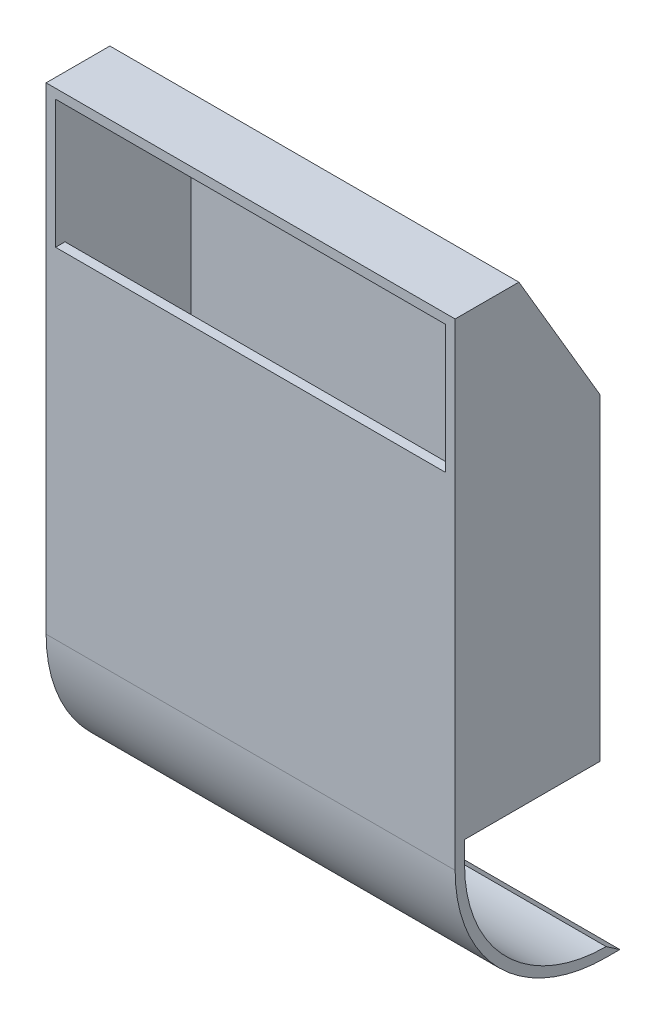
ISO-10303-21;
HEADER;
FILE_DESCRIPTION(('STEP AP214'),'2;1');
FILE_NAME('part.step','',(''),(''),'','','');
FILE_SCHEMA(('AUTOMOTIVE_DESIGN { 1 0 10303 214 1 1 1 1 }'));
ENDSEC;
DATA;
#1=APPLICATION_CONTEXT('core data for automotive mechanical design processes');
#2=APPLICATION_PROTOCOL_DEFINITION('international standard','automotive_design',2000,#1);
#3=PRODUCT_CONTEXT('',#1,'mechanical');
#4=PRODUCT('Part','Part','',(#3));
#5=PRODUCT_RELATED_PRODUCT_CATEGORY('part','',(#4));
#6=PRODUCT_DEFINITION_FORMATION('','',#4);
#7=PRODUCT_DEFINITION_CONTEXT('part definition',#1,'design');
#8=PRODUCT_DEFINITION('design','',#6,#7);
#9=PRODUCT_DEFINITION_SHAPE('','',#8);
#10=(LENGTH_UNIT() NAMED_UNIT(*) SI_UNIT(.MILLI.,.METRE.));
#11=(NAMED_UNIT(*) PLANE_ANGLE_UNIT() SI_UNIT($,.RADIAN.));
#12=(NAMED_UNIT(*) SI_UNIT($,.STERADIAN.) SOLID_ANGLE_UNIT());
#13=UNCERTAINTY_MEASURE_WITH_UNIT(LENGTH_MEASURE(1.E-05),#10,'distance_accuracy_value','');
#14=(GEOMETRIC_REPRESENTATION_CONTEXT(3) GLOBAL_UNCERTAINTY_ASSIGNED_CONTEXT((#13)) GLOBAL_UNIT_ASSIGNED_CONTEXT((#10,
#11,#12)) REPRESENTATION_CONTEXT('',''));
#15=CARTESIAN_POINT('',(0.,0.,0.));
#16=DIRECTION('',(0.,0.,1.));
#17=DIRECTION('',(1.,0.,0.));
#18=AXIS2_PLACEMENT_3D('',#15,#16,#17);
#19=CARTESIAN_POINT('',(0.,108.,-43.0406580426315));
#20=DIRECTION('',(0.,-0.499999999999998,0.86602540378444));
#21=DIRECTION('',(0.,-0.86602540378444,-0.499999999999998));
#22=AXIS2_PLACEMENT_3D('',#19,#20,#21);
#23=PLANE('',#22);
#24=DIRECTION('',(1.,0.,0.));
#25=VECTOR('',#24,1.);
#26=CARTESIAN_POINT('',(0.,148.765449908796,-19.5047145641519));
#27=LINE('',#26,#25);
#28=CARTESIAN_POINT('',(3.,148.765449908796,-19.5047145641519));
#29=VERTEX_POINT('',#28);
#30=CARTESIAN_POINT('',(127.,148.765449908796,-19.5047145641519));
#31=VERTEX_POINT('',#30);
#32=EDGE_CURVE('E182',#29,#31,#27,.T.);
#33=ORIENTED_EDGE('',*,*,#32,.F.);
#34=DIRECTION('',(0.,-0.86602540378444,-0.499999999999998));
#35=VECTOR('',#34,1.);
#36=CARTESIAN_POINT('',(3.,148.765449908796,-19.5047145641519));
#37=LINE('',#36,#35);
#38=CARTESIAN_POINT('',(3.,108.,-43.0406580426315));
#39=VERTEX_POINT('',#38);
#40=EDGE_CURVE('E167',#29,#39,#37,.T.);
#41=ORIENTED_EDGE('',*,*,#40,.T.);
#42=DIRECTION('',(1.,0.,0.));
#43=VECTOR('',#42,1.);
#44=CARTESIAN_POINT('',(0.,108.,-43.0406580426315));
#45=LINE('',#44,#43);
#46=CARTESIAN_POINT('',(127.,108.,-43.0406580426315));
#47=VERTEX_POINT('',#46);
#48=EDGE_CURVE('E178',#39,#47,#45,.T.);
#49=ORIENTED_EDGE('',*,*,#48,.T.);
#50=DIRECTION('',(0.,0.86602540378444,0.499999999999998));
#51=VECTOR('',#50,1.);
#52=CARTESIAN_POINT('',(127.,148.765449908796,-19.5047145641519));
#53=LINE('',#52,#51);
#54=EDGE_CURVE('E334',#47,#31,#53,.T.);
#55=ORIENTED_EDGE('',*,*,#54,.T.);
#56=EDGE_LOOP('',(#33,#41,#49,#55));
#57=FACE_BOUND('',#56,.T.);
#58=ADVANCED_FACE('F39',(#57),#23,.T.);
#59=CARTESIAN_POINT('',(0.,148.765449908796,-19.5047145641519));
#60=DIRECTION('',(0.,-1.,0.));
#61=DIRECTION('',(0.,0.,-1.));
#62=AXIS2_PLACEMENT_3D('',#59,#60,#61);
#63=PLANE('',#62);
#64=DIRECTION('',(1.,0.,0.));
#65=VECTOR('',#64,1.);
#66=CARTESIAN_POINT('',(0.,148.765449908796,0.));
#67=LINE('',#66,#65);
#68=CARTESIAN_POINT('',(3.,148.765449908796,0.));
#69=VERTEX_POINT('',#68);
#70=CARTESIAN_POINT('',(127.,148.765449908796,0.));
#71=VERTEX_POINT('',#70);
#72=EDGE_CURVE('E62',#69,#71,#67,.T.);
#73=ORIENTED_EDGE('',*,*,#72,.F.);
#74=DIRECTION('',(0.,0.,-1.));
#75=VECTOR('',#74,1.);
#76=CARTESIAN_POINT('',(3.,148.765449908796,0.));
#77=LINE('',#76,#75);
#78=EDGE_CURVE('E333',#69,#29,#77,.T.);
#79=ORIENTED_EDGE('',*,*,#78,.T.);
#80=ORIENTED_EDGE('',*,*,#32,.T.);
#81=DIRECTION('',(0.,0.,1.));
#82=VECTOR('',#81,1.);
#83=CARTESIAN_POINT('',(127.,148.765449908796,0.));
#84=LINE('',#83,#82);
#85=EDGE_CURVE('E329',#31,#71,#84,.T.);
#86=ORIENTED_EDGE('',*,*,#85,.T.);
#87=EDGE_LOOP('',(#73,#79,#80,#86));
#88=FACE_BOUND('',#87,.T.);
#89=ADVANCED_FACE('F341',(#88),#63,.T.);
#90=CARTESIAN_POINT('',(130.,108.,-3.));
#91=DIRECTION('',(0.,-1.,0.));
#92=DIRECTION('',(0.,0.,-1.));
#93=AXIS2_PLACEMENT_3D('',#90,#91,#92);
#94=PLANE('',#93);
#95=ORIENTED_EDGE('',*,*,#48,.F.);
#96=DIRECTION('',(0.,0.,1.));
#97=VECTOR('',#96,1.);
#98=CARTESIAN_POINT('',(3.,108.,-43.0406580426315));
#99=LINE('',#98,#97);
#100=CARTESIAN_POINT('',(3.,108.,-43.));
#101=VERTEX_POINT('',#100);
#102=EDGE_CURVE('E165',#39,#101,#99,.T.);
#103=ORIENTED_EDGE('',*,*,#102,.T.);
#104=DIRECTION('',(1.,0.,0.));
#105=VECTOR('',#104,1.);
#106=CARTESIAN_POINT('',(130.,108.,-43.));
#107=LINE('',#106,#105);
#108=CARTESIAN_POINT('',(127.,108.,-43.));
#109=VERTEX_POINT('',#108);
#110=EDGE_CURVE('E186',#101,#109,#107,.T.);
#111=ORIENTED_EDGE('',*,*,#110,.T.);
#112=DIRECTION('',(0.,0.,-1.));
#113=VECTOR('',#112,1.);
#114=CARTESIAN_POINT('',(127.,108.,-43.0406580426315));
#115=LINE('',#114,#113);
#116=EDGE_CURVE('E183',#109,#47,#115,.T.);
#117=ORIENTED_EDGE('',*,*,#116,.T.);
#118=EDGE_LOOP('',(#95,#103,#111,#117));
#119=FACE_BOUND('',#118,.T.);
#120=ADVANCED_FACE('F184',(#119),#94,.F.);
#121=DIRECTION('',(-1.,0.,0.));
#122=VECTOR('',#121,1.);
#123=CARTESIAN_POINT('',(130.,108.,-3.));
#124=LINE('',#123,#122);
#125=CARTESIAN_POINT('',(127.,108.,-3.));
#126=VERTEX_POINT('',#125);
#127=CARTESIAN_POINT('',(3.,108.,-3.));
#128=VERTEX_POINT('',#127);
#129=EDGE_CURVE('E273',#126,#128,#124,.T.);
#130=ORIENTED_EDGE('',*,*,#129,.T.);
#131=CARTESIAN_POINT('',(3.,108.,0.));
#132=VERTEX_POINT('',#131);
#133=EDGE_CURVE('E171',#128,#132,#99,.T.);
#134=ORIENTED_EDGE('',*,*,#133,.T.);
#135=DIRECTION('',(-1.,0.,0.));
#136=VECTOR('',#135,1.);
#137=CARTESIAN_POINT('',(130.,108.,0.));
#138=LINE('',#137,#136);
#139=CARTESIAN_POINT('',(127.,108.,0.));
#140=VERTEX_POINT('',#139);
#141=EDGE_CURVE('E271',#140,#132,#138,.T.);
#142=ORIENTED_EDGE('',*,*,#141,.F.);
#143=EDGE_CURVE('E321',#140,#126,#115,.T.);
#144=ORIENTED_EDGE('',*,*,#143,.T.);
#145=EDGE_LOOP('',(#130,#134,#142,#144));
#146=FACE_BOUND('',#145,.T.);
#147=ADVANCED_FACE('F346',(#146),#94,.F.);
#148=CARTESIAN_POINT('',(130.,0.,-3.));
#149=DIRECTION('',(0.,0.,1.));
#150=DIRECTION('',(0.,-1.,0.));
#151=AXIS2_PLACEMENT_3D('',#148,#149,#150);
#152=PLANE('',#151);
#153=DIRECTION('',(0.,1.,0.));
#154=VECTOR('',#153,1.);
#155=CARTESIAN_POINT('',(127.,108.,-3.));
#156=LINE('',#155,#154);
#157=CARTESIAN_POINT('',(127.,6.9608670771828,-3.));
#158=VERTEX_POINT('',#157);
#159=EDGE_CURVE('E218',#158,#126,#156,.T.);
#160=ORIENTED_EDGE('',*,*,#159,.F.);
#161=DIRECTION('',(-1.,0.,0.));
#162=VECTOR('',#161,1.);
#163=CARTESIAN_POINT('',(130.,6.9608670771828,-3.));
#164=LINE('',#163,#162);
#165=CARTESIAN_POINT('',(130.,6.9608670771828,-3.));
#166=VERTEX_POINT('',#165);
#167=EDGE_CURVE('E219',#166,#158,#164,.T.);
#168=ORIENTED_EDGE('',*,*,#167,.F.);
#169=DIRECTION('',(0.,1.,0.));
#170=VECTOR('',#169,1.);
#171=CARTESIAN_POINT('',(130.,0.,-3.));
#172=LINE('',#171,#170);
#173=CARTESIAN_POINT('',(130.,0.,-3.));
#174=VERTEX_POINT('',#173);
#175=EDGE_CURVE('E252',#174,#166,#172,.T.);
#176=ORIENTED_EDGE('',*,*,#175,.F.);
#177=DIRECTION('',(-1.,0.,0.));
#178=VECTOR('',#177,1.);
#179=CARTESIAN_POINT('',(130.,0.,-3.));
#180=LINE('',#179,#178);
#181=CARTESIAN_POINT('',(0.,0.,-3.));
#182=VERTEX_POINT('',#181);
#183=EDGE_CURVE('E280',#174,#182,#180,.T.);
#184=ORIENTED_EDGE('',*,*,#183,.T.);
#185=DIRECTION('',(0.,1.,0.));
#186=VECTOR('',#185,1.);
#187=CARTESIAN_POINT('',(0.,0.,-3.));
#188=LINE('',#187,#186);
#189=CARTESIAN_POINT('',(0.,6.9608670771828,-3.));
#190=VERTEX_POINT('',#189);
#191=EDGE_CURVE('E266',#182,#190,#188,.T.);
#192=ORIENTED_EDGE('',*,*,#191,.T.);
#193=DIRECTION('',(-1.,0.,0.));
#194=VECTOR('',#193,1.);
#195=CARTESIAN_POINT('',(0.,6.9608670771828,-3.));
#196=LINE('',#195,#194);
#197=CARTESIAN_POINT('',(3.,6.9608670771828,-3.));
#198=VERTEX_POINT('',#197);
#199=EDGE_CURVE('E240',#198,#190,#196,.T.);
#200=ORIENTED_EDGE('',*,*,#199,.F.);
#201=DIRECTION('',(0.,-1.,0.));
#202=VECTOR('',#201,1.);
#203=CARTESIAN_POINT('',(3.,108.,-3.));
#204=LINE('',#203,#202);
#205=EDGE_CURVE('E224',#128,#198,#204,.T.);
#206=ORIENTED_EDGE('',*,*,#205,.F.);
#207=ORIENTED_EDGE('',*,*,#129,.F.);
#208=EDGE_LOOP('',(#160,#168,#176,#184,#192,#200,#206,#207));
#209=FACE_BOUND('',#208,.T.);
#210=ADVANCED_FACE('F301',(#209),#152,.F.);
#211=CARTESIAN_POINT('',(130.,0.,-48.));
#212=DIRECTION('',(-1.,0.,0.));
#213=DIRECTION('',(0.,0.,1.));
#214=AXIS2_PLACEMENT_3D('',#211,#212,#213);
#215=CYLINDRICAL_SURFACE('',#214,48.);
#216=CARTESIAN_POINT('',(0.,0.,-48.));
#217=DIRECTION('',(1.,0.,0.));
#218=DIRECTION('',(0.,0.,-1.));
#219=AXIS2_PLACEMENT_3D('',#216,#217,#218);
#220=CIRCLE('',#219,48.);
#221=CARTESIAN_POINT('',(0.,0.,0.));
#222=VERTEX_POINT('',#221);
#223=CARTESIAN_POINT('',(0.,-48.,-48.));
#224=VERTEX_POINT('',#223);
#225=EDGE_CURVE('E231',#222,#224,#220,.T.);
#226=ORIENTED_EDGE('',*,*,#225,.T.);
#227=DIRECTION('',(-1.,0.,0.));
#228=VECTOR('',#227,1.);
#229=CARTESIAN_POINT('',(130.,-48.,-48.));
#230=LINE('',#229,#228);
#231=CARTESIAN_POINT('',(130.,-48.,-48.));
#232=VERTEX_POINT('',#231);
#233=EDGE_CURVE('E11',#232,#224,#230,.T.);
#234=ORIENTED_EDGE('',*,*,#233,.F.);
#235=CARTESIAN_POINT('',(130.,0.,-48.));
#236=DIRECTION('',(1.,0.,0.));
#237=DIRECTION('',(0.,0.,-1.));
#238=AXIS2_PLACEMENT_3D('',#235,#236,#237);
#239=CIRCLE('',#238,48.);
#240=CARTESIAN_POINT('',(130.,0.,0.));
#241=VERTEX_POINT('',#240);
#242=EDGE_CURVE('E244',#241,#232,#239,.T.);
#243=ORIENTED_EDGE('',*,*,#242,.F.);
#244=DIRECTION('',(-1.,0.,0.));
#245=VECTOR('',#244,1.);
#246=CARTESIAN_POINT('',(130.,0.,0.));
#247=LINE('',#246,#245);
#248=EDGE_CURVE('E260',#241,#222,#247,.T.);
#249=ORIENTED_EDGE('',*,*,#248,.T.);
#250=EDGE_LOOP('',(#226,#234,#243,#249));
#251=FACE_BOUND('',#250,.T.);
#252=ADVANCED_FACE('F41',(#251),#215,.T.);
#253=CARTESIAN_POINT('',(130.,-48.,-52.3714784745486));
#254=DIRECTION('',(0.,1.,0.));
#255=DIRECTION('',(0.,0.,1.));
#256=AXIS2_PLACEMENT_3D('',#253,#254,#255);
#257=PLANE('',#256);
#258=DIRECTION('',(0.,0.,-1.));
#259=VECTOR('',#258,1.);
#260=CARTESIAN_POINT('',(0.,-48.,-52.3714784745486));
#261=LINE('',#260,#259);
#262=CARTESIAN_POINT('',(0.,-48.,-52.3714784745486));
#263=VERTEX_POINT('',#262);
#264=EDGE_CURVE('E257',#224,#263,#261,.T.);
#265=ORIENTED_EDGE('',*,*,#264,.T.);
#266=DIRECTION('',(-1.,0.,0.));
#267=VECTOR('',#266,1.);
#268=CARTESIAN_POINT('',(130.,-48.,-52.3714784745486));
#269=LINE('',#268,#267);
#270=CARTESIAN_POINT('',(130.,-48.,-52.3714784745486));
#271=VERTEX_POINT('',#270);
#272=EDGE_CURVE('E50',#271,#263,#269,.T.);
#273=ORIENTED_EDGE('',*,*,#272,.F.);
#274=DIRECTION('',(0.,0.,-1.));
#275=VECTOR('',#274,1.);
#276=CARTESIAN_POINT('',(130.,-48.,-52.3714784745486));
#277=LINE('',#276,#275);
#278=EDGE_CURVE('E243',#232,#271,#277,.T.);
#279=ORIENTED_EDGE('',*,*,#278,.F.);
#280=ORIENTED_EDGE('',*,*,#233,.T.);
#281=EDGE_LOOP('',(#265,#273,#279,#280));
#282=FACE_BOUND('',#281,.T.);
#283=ADVANCED_FACE('F359',(#282),#257,.F.);
#284=CARTESIAN_POINT('',(130.,-45.,-48.));
#285=DIRECTION('',(0.,-0.824516366260915,0.5658381056167));
#286=DIRECTION('',(0.,-0.5658381056167,-0.824516366260915));
#287=AXIS2_PLACEMENT_3D('',#284,#285,#286);
#288=PLANE('',#287);
#289=DIRECTION('',(0.,0.565838105616701,0.824516366260915));
#290=VECTOR('',#289,1.);
#291=CARTESIAN_POINT('',(0.,-45.,-48.));
#292=LINE('',#291,#290);
#293=CARTESIAN_POINT('',(0.,-45.,-48.));
#294=VERTEX_POINT('',#293);
#295=EDGE_CURVE('E265',#263,#294,#292,.T.);
#296=ORIENTED_EDGE('',*,*,#295,.T.);
#297=DIRECTION('',(-1.,0.,0.));
#298=VECTOR('',#297,1.);
#299=CARTESIAN_POINT('',(130.,-45.,-48.));
#300=LINE('',#299,#298);
#301=CARTESIAN_POINT('',(130.,-45.,-48.));
#302=VERTEX_POINT('',#301);
#303=EDGE_CURVE('E278',#302,#294,#300,.T.);
#304=ORIENTED_EDGE('',*,*,#303,.F.);
#305=DIRECTION('',(0.,0.565838105616701,0.824516366260915));
#306=VECTOR('',#305,1.);
#307=CARTESIAN_POINT('',(130.,-45.,-48.));
#308=LINE('',#307,#306);
#309=EDGE_CURVE('E249',#271,#302,#308,.T.);
#310=ORIENTED_EDGE('',*,*,#309,.F.);
#311=ORIENTED_EDGE('',*,*,#272,.T.);
#312=EDGE_LOOP('',(#296,#304,#310,#311));
#313=FACE_BOUND('',#312,.T.);
#314=ADVANCED_FACE('F287',(#313),#288,.F.);
#315=CARTESIAN_POINT('',(130.,0.,-48.));
#316=DIRECTION('',(-1.,0.,0.));
#317=DIRECTION('',(0.,0.,1.));
#318=AXIS2_PLACEMENT_3D('',#315,#316,#317);
#319=CYLINDRICAL_SURFACE('',#318,45.);
#320=CARTESIAN_POINT('',(0.,0.,-48.));
#321=DIRECTION('',(-1.,0.,0.));
#322=DIRECTION('',(0.,0.,-1.));
#323=AXIS2_PLACEMENT_3D('',#320,#321,#322);
#324=CIRCLE('',#323,45.);
#325=EDGE_CURVE('E262',#294,#182,#324,.T.);
#326=ORIENTED_EDGE('',*,*,#325,.T.);
#327=ORIENTED_EDGE('',*,*,#183,.F.);
#328=CARTESIAN_POINT('',(130.,0.,-48.));
#329=DIRECTION('',(-1.,0.,0.));
#330=DIRECTION('',(0.,0.,-1.));
#331=AXIS2_PLACEMENT_3D('',#328,#329,#330);
#332=CIRCLE('',#331,45.);
#333=EDGE_CURVE('E250',#302,#174,#332,.T.);
#334=ORIENTED_EDGE('',*,*,#333,.F.);
#335=ORIENTED_EDGE('',*,*,#303,.T.);
#336=EDGE_LOOP('',(#326,#327,#334,#335));
#337=FACE_BOUND('',#336,.T.);
#338=ADVANCED_FACE('F299',(#337),#319,.F.);
#339=CARTESIAN_POINT('',(130.,0.,0.));
#340=DIRECTION('',(0.,0.,-1.));
#341=DIRECTION('',(-1.,0.,0.));
#342=AXIS2_PLACEMENT_3D('',#339,#340,#341);
#343=PLANE('',#342);
#344=DIRECTION('',(0.,1.,0.));
#345=VECTOR('',#344,1.);
#346=CARTESIAN_POINT('',(3.,148.765449908796,0.));
#347=LINE('',#346,#345);
#348=EDGE_CURVE('E53',#132,#69,#347,.T.);
#349=ORIENTED_EDGE('',*,*,#348,.T.);
#350=ORIENTED_EDGE('',*,*,#72,.T.);
#351=DIRECTION('',(0.,-1.,0.));
#352=VECTOR('',#351,1.);
#353=CARTESIAN_POINT('',(127.,148.765449908796,0.));
#354=LINE('',#353,#352);
#355=EDGE_CURVE('E327',#71,#140,#354,.T.);
#356=ORIENTED_EDGE('',*,*,#355,.T.);
#357=ORIENTED_EDGE('',*,*,#141,.T.);
#358=EDGE_LOOP('',(#349,#350,#356,#357));
#359=FACE_BOUND('',#358,.T.);
#360=DIRECTION('',(0.,-1.,0.));
#361=VECTOR('',#360,1.);
#362=CARTESIAN_POINT('',(0.,0.,0.));
#363=LINE('',#362,#361);
#364=CARTESIAN_POINT('',(0.,151.765449908796,0.));
#365=VERTEX_POINT('',#364);
#366=EDGE_CURVE('E246',#365,#222,#363,.T.);
#367=ORIENTED_EDGE('',*,*,#366,.T.);
#368=ORIENTED_EDGE('',*,*,#248,.F.);
#369=DIRECTION('',(0.,-1.,0.));
#370=VECTOR('',#369,1.);
#371=CARTESIAN_POINT('',(130.,0.,0.));
#372=LINE('',#371,#370);
#373=CARTESIAN_POINT('',(130.,151.765449908796,0.));
#374=VERTEX_POINT('',#373);
#375=EDGE_CURVE('E254',#374,#241,#372,.T.);
#376=ORIENTED_EDGE('',*,*,#375,.F.);
#377=DIRECTION('',(1.,0.,0.));
#378=VECTOR('',#377,1.);
#379=CARTESIAN_POINT('',(0.,151.765449908796,0.));
#380=LINE('',#379,#378);
#381=EDGE_CURVE('E197',#365,#374,#380,.T.);
#382=ORIENTED_EDGE('',*,*,#381,.F.);
#383=EDGE_LOOP('',(#367,#368,#376,#382));
#384=FACE_BOUND('',#383,.T.);
#385=ADVANCED_FACE('F339',(#359,#384),#343,.F.);
#386=CARTESIAN_POINT('',(130.,0.,-48.));
#387=DIRECTION('',(1.,0.,0.));
#388=DIRECTION('',(0.,0.,-1.));
#389=AXIS2_PLACEMENT_3D('',#386,#387,#388);
#390=PLANE('',#389);
#391=DIRECTION('',(0.,0.,1.));
#392=VECTOR('',#391,1.);
#393=CARTESIAN_POINT('',(130.,151.765449908796,0.));
#394=LINE('',#393,#392);
#395=CARTESIAN_POINT('',(130.,151.765449908796,-20.2657661121389));
#396=VERTEX_POINT('',#395);
#397=EDGE_CURVE('E194',#396,#374,#394,.T.);
#398=ORIENTED_EDGE('',*,*,#397,.T.);
#399=ORIENTED_EDGE('',*,*,#375,.T.);
#400=ORIENTED_EDGE('',*,*,#242,.T.);
#401=ORIENTED_EDGE('',*,*,#278,.T.);
#402=ORIENTED_EDGE('',*,*,#309,.T.);
#403=ORIENTED_EDGE('',*,*,#333,.T.);
#404=ORIENTED_EDGE('',*,*,#175,.T.);
#405=DIRECTION('',(0.,0.,1.));
#406=VECTOR('',#405,1.);
#407=CARTESIAN_POINT('',(130.,6.9608670771828,-43.));
#408=LINE('',#407,#406);
#409=CARTESIAN_POINT('',(130.,6.9608670771828,-46.));
#410=VERTEX_POINT('',#409);
#411=EDGE_CURVE('E230',#410,#166,#408,.T.);
#412=ORIENTED_EDGE('',*,*,#411,.F.);
#413=DIRECTION('',(0.,-1.,0.));
#414=VECTOR('',#413,1.);
#415=CARTESIAN_POINT('',(130.,108.,-46.));
#416=LINE('',#415,#414);
#417=CARTESIAN_POINT('',(130.,108.,-46.));
#418=VERTEX_POINT('',#417);
#419=EDGE_CURVE('E201',#418,#410,#416,.T.);
#420=ORIENTED_EDGE('',*,*,#419,.F.);
#421=DIRECTION('',(0.,0.862021556630273,0.506871616787447));
#422=VECTOR('',#421,1.);
#423=CARTESIAN_POINT('',(130.,151.765449908796,-20.2657661121389));
#424=LINE('',#423,#422);
#425=EDGE_CURVE('E312',#418,#396,#424,.T.);
#426=ORIENTED_EDGE('',*,*,#425,.T.);
#427=EDGE_LOOP('',(#398,#399,#400,#401,#402,#403,#404,#412,#420,#426));
#428=FACE_BOUND('',#427,.T.);
#429=ADVANCED_FACE('F303',(#428),#390,.T.);
#430=CARTESIAN_POINT('',(0.,0.,-48.));
#431=DIRECTION('',(1.,0.,0.));
#432=DIRECTION('',(0.,0.,-1.));
#433=AXIS2_PLACEMENT_3D('',#430,#431,#432);
#434=PLANE('',#433);
#435=ORIENTED_EDGE('',*,*,#225,.F.);
#436=ORIENTED_EDGE('',*,*,#366,.F.);
#437=DIRECTION('',(0.,0.,1.));
#438=VECTOR('',#437,1.);
#439=CARTESIAN_POINT('',(0.,151.765449908796,0.));
#440=LINE('',#439,#438);
#441=CARTESIAN_POINT('',(0.,151.765449908796,-20.2657661121389));
#442=VERTEX_POINT('',#441);
#443=EDGE_CURVE('E205',#442,#365,#440,.T.);
#444=ORIENTED_EDGE('',*,*,#443,.F.);
#445=DIRECTION('',(0.,0.862021556630273,0.506871616787447));
#446=VECTOR('',#445,1.);
#447=CARTESIAN_POINT('',(0.,151.765449908796,-20.2657661121389));
#448=LINE('',#447,#446);
#449=CARTESIAN_POINT('',(0.,108.,-46.));
#450=VERTEX_POINT('',#449);
#451=EDGE_CURVE('E325',#450,#442,#448,.T.);
#452=ORIENTED_EDGE('',*,*,#451,.F.);
#453=DIRECTION('',(0.,1.,0.));
#454=VECTOR('',#453,1.);
#455=CARTESIAN_POINT('',(0.,108.,-46.));
#456=LINE('',#455,#454);
#457=CARTESIAN_POINT('',(0.,6.9608670771828,-46.));
#458=VERTEX_POINT('',#457);
#459=EDGE_CURVE('E207',#458,#450,#456,.T.);
#460=ORIENTED_EDGE('',*,*,#459,.F.);
#461=DIRECTION('',(0.,0.,1.));
#462=VECTOR('',#461,1.);
#463=CARTESIAN_POINT('',(0.,6.9608670771828,-43.));
#464=LINE('',#463,#462);
#465=EDGE_CURVE('E233',#458,#190,#464,.T.);
#466=ORIENTED_EDGE('',*,*,#465,.T.);
#467=ORIENTED_EDGE('',*,*,#191,.F.);
#468=ORIENTED_EDGE('',*,*,#325,.F.);
#469=ORIENTED_EDGE('',*,*,#295,.F.);
#470=ORIENTED_EDGE('',*,*,#264,.F.);
#471=EDGE_LOOP('',(#435,#436,#444,#452,#460,#466,#467,#468,#469,#470));
#472=FACE_BOUND('',#471,.T.);
#473=ADVANCED_FACE('F291',(#472),#434,.F.);
#474=CARTESIAN_POINT('',(3.,108.,-43.));
#475=DIRECTION('',(-1.,0.,0.));
#476=DIRECTION('',(0.,0.,1.));
#477=AXIS2_PLACEMENT_3D('',#474,#475,#476);
#478=PLANE('',#477);
#479=ORIENTED_EDGE('',*,*,#205,.T.);
#480=DIRECTION('',(0.,0.,1.));
#481=VECTOR('',#480,1.);
#482=CARTESIAN_POINT('',(3.,6.9608670771828,-43.));
#483=LINE('',#482,#481);
#484=CARTESIAN_POINT('',(3.,6.9608670771828,-43.));
#485=VERTEX_POINT('',#484);
#486=EDGE_CURVE('E215',#485,#198,#483,.T.);
#487=ORIENTED_EDGE('',*,*,#486,.F.);
#488=DIRECTION('',(0.,-1.,0.));
#489=VECTOR('',#488,1.);
#490=CARTESIAN_POINT('',(3.,108.,-43.));
#491=LINE('',#490,#489);
#492=EDGE_CURVE('E166',#101,#485,#491,.T.);
#493=ORIENTED_EDGE('',*,*,#492,.F.);
#494=ORIENTED_EDGE('',*,*,#102,.F.);
#495=ORIENTED_EDGE('',*,*,#40,.F.);
#496=ORIENTED_EDGE('',*,*,#78,.F.);
#497=ORIENTED_EDGE('',*,*,#348,.F.);
#498=ORIENTED_EDGE('',*,*,#133,.F.);
#499=EDGE_LOOP('',(#479,#487,#493,#494,#495,#496,#497,#498));
#500=FACE_BOUND('',#499,.T.);
#501=ADVANCED_FACE('F164',(#500),#478,.F.);
#502=CARTESIAN_POINT('',(130.,6.9608670771828,-43.));
#503=DIRECTION('',(0.,1.,0.));
#504=DIRECTION('',(0.,0.,1.));
#505=AXIS2_PLACEMENT_3D('',#502,#503,#504);
#506=PLANE('',#505);
#507=ORIENTED_EDGE('',*,*,#167,.T.);
#508=DIRECTION('',(0.,0.,1.));
#509=VECTOR('',#508,1.);
#510=CARTESIAN_POINT('',(127.,6.9608670771828,-43.));
#511=LINE('',#510,#509);
#512=CARTESIAN_POINT('',(127.,6.9608670771828,-43.));
#513=VERTEX_POINT('',#512);
#514=EDGE_CURVE('E217',#513,#158,#511,.T.);
#515=ORIENTED_EDGE('',*,*,#514,.F.);
#516=DIRECTION('',(-1.,0.,0.));
#517=VECTOR('',#516,1.);
#518=CARTESIAN_POINT('',(130.,6.9608670771828,-43.));
#519=LINE('',#518,#517);
#520=EDGE_CURVE('E187',#513,#485,#519,.T.);
#521=ORIENTED_EDGE('',*,*,#520,.T.);
#522=ORIENTED_EDGE('',*,*,#486,.T.);
#523=ORIENTED_EDGE('',*,*,#199,.T.);
#524=ORIENTED_EDGE('',*,*,#465,.F.);
#525=DIRECTION('',(-1.,0.,0.));
#526=VECTOR('',#525,1.);
#527=CARTESIAN_POINT('',(130.,6.9608670771828,-46.));
#528=LINE('',#527,#526);
#529=EDGE_CURVE('E206',#410,#458,#528,.T.);
#530=ORIENTED_EDGE('',*,*,#529,.F.);
#531=ORIENTED_EDGE('',*,*,#411,.T.);
#532=EDGE_LOOP('',(#507,#515,#521,#522,#523,#524,#530,#531));
#533=FACE_BOUND('',#532,.T.);
#534=ADVANCED_FACE('F306',(#533),#506,.F.);
#535=CARTESIAN_POINT('',(127.,108.,-43.));
#536=DIRECTION('',(1.,0.,0.));
#537=DIRECTION('',(0.,0.,-1.));
#538=AXIS2_PLACEMENT_3D('',#535,#536,#537);
#539=PLANE('',#538);
#540=ORIENTED_EDGE('',*,*,#159,.T.);
#541=ORIENTED_EDGE('',*,*,#143,.F.);
#542=ORIENTED_EDGE('',*,*,#355,.F.);
#543=ORIENTED_EDGE('',*,*,#85,.F.);
#544=ORIENTED_EDGE('',*,*,#54,.F.);
#545=ORIENTED_EDGE('',*,*,#116,.F.);
#546=DIRECTION('',(0.,1.,0.));
#547=VECTOR('',#546,1.);
#548=CARTESIAN_POINT('',(127.,108.,-43.));
#549=LINE('',#548,#547);
#550=EDGE_CURVE('E214',#513,#109,#549,.T.);
#551=ORIENTED_EDGE('',*,*,#550,.F.);
#552=ORIENTED_EDGE('',*,*,#514,.T.);
#553=EDGE_LOOP('',(#540,#541,#542,#543,#544,#545,#551,#552));
#554=FACE_BOUND('',#553,.T.);
#555=ADVANCED_FACE('F343',(#554),#539,.F.);
#556=CARTESIAN_POINT('',(0.,0.,-43.));
#557=DIRECTION('',(0.,0.,-1.));
#558=DIRECTION('',(-1.,0.,0.));
#559=AXIS2_PLACEMENT_3D('',#556,#557,#558);
#560=PLANE('',#559);
#561=ORIENTED_EDGE('',*,*,#110,.F.);
#562=ORIENTED_EDGE('',*,*,#492,.T.);
#563=ORIENTED_EDGE('',*,*,#520,.F.);
#564=ORIENTED_EDGE('',*,*,#550,.T.);
#565=EDGE_LOOP('',(#561,#562,#563,#564));
#566=FACE_BOUND('',#565,.T.);
#567=ADVANCED_FACE('F377',(#566),#560,.F.);
#568=CARTESIAN_POINT('',(0.,0.,-46.));
#569=DIRECTION('',(0.,0.,-1.));
#570=DIRECTION('',(-1.,0.,0.));
#571=AXIS2_PLACEMENT_3D('',#568,#569,#570);
#572=PLANE('',#571);
#573=ORIENTED_EDGE('',*,*,#419,.T.);
#574=ORIENTED_EDGE('',*,*,#529,.T.);
#575=ORIENTED_EDGE('',*,*,#459,.T.);
#576=DIRECTION('',(1.,0.,0.));
#577=VECTOR('',#576,1.);
#578=CARTESIAN_POINT('',(130.,108.,-46.));
#579=LINE('',#578,#577);
#580=EDGE_CURVE('E211',#450,#418,#579,.T.);
#581=ORIENTED_EDGE('',*,*,#580,.T.);
#582=EDGE_LOOP('',(#573,#574,#575,#581));
#583=FACE_BOUND('',#582,.T.);
#584=ADVANCED_FACE('F313',(#583),#572,.T.);
#585=CARTESIAN_POINT('',(0.,151.765449908796,0.));
#586=DIRECTION('',(0.,1.,0.));
#587=DIRECTION('',(0.,0.,1.));
#588=AXIS2_PLACEMENT_3D('',#585,#586,#587);
#589=PLANE('',#588);
#590=ORIENTED_EDGE('',*,*,#397,.F.);
#591=DIRECTION('',(1.,0.,0.));
#592=VECTOR('',#591,1.);
#593=CARTESIAN_POINT('',(0.,151.765449908796,-20.2657661121389));
#594=LINE('',#593,#592);
#595=EDGE_CURVE('E199',#442,#396,#594,.T.);
#596=ORIENTED_EDGE('',*,*,#595,.F.);
#597=ORIENTED_EDGE('',*,*,#443,.T.);
#598=ORIENTED_EDGE('',*,*,#381,.T.);
#599=EDGE_LOOP('',(#590,#596,#597,#598));
#600=FACE_BOUND('',#599,.T.);
#601=ADVANCED_FACE('F355',(#600),#589,.T.);
#602=CARTESIAN_POINT('',(0.,151.765449908796,-20.2657661121389));
#603=DIRECTION('',(0.,0.506871616787447,-0.862021556630273));
#604=DIRECTION('',(0.,0.862021556630273,0.506871616787447));
#605=AXIS2_PLACEMENT_3D('',#602,#603,#604);
#606=PLANE('',#605);
#607=ORIENTED_EDGE('',*,*,#425,.F.);
#608=ORIENTED_EDGE('',*,*,#580,.F.);
#609=ORIENTED_EDGE('',*,*,#451,.T.);
#610=ORIENTED_EDGE('',*,*,#595,.T.);
#611=EDGE_LOOP('',(#607,#608,#609,#610));
#612=FACE_BOUND('',#611,.T.);
#613=ADVANCED_FACE('F320',(#612),#606,.T.);
#614=CLOSED_SHELL('',(#58,#89,#120,#147,#210,#252,#283,#314,#338,#385,#429,#473,#501,#534,#555,
#567,#584,#601,#613));
#615=MANIFOLD_SOLID_BREP('B2',#614);
#616=ADVANCED_BREP_SHAPE_REPRESENTATION('',(#18,#615),#14);
#617=SHAPE_DEFINITION_REPRESENTATION(#9,#616);
ENDSEC;
END-ISO-10303-21;
